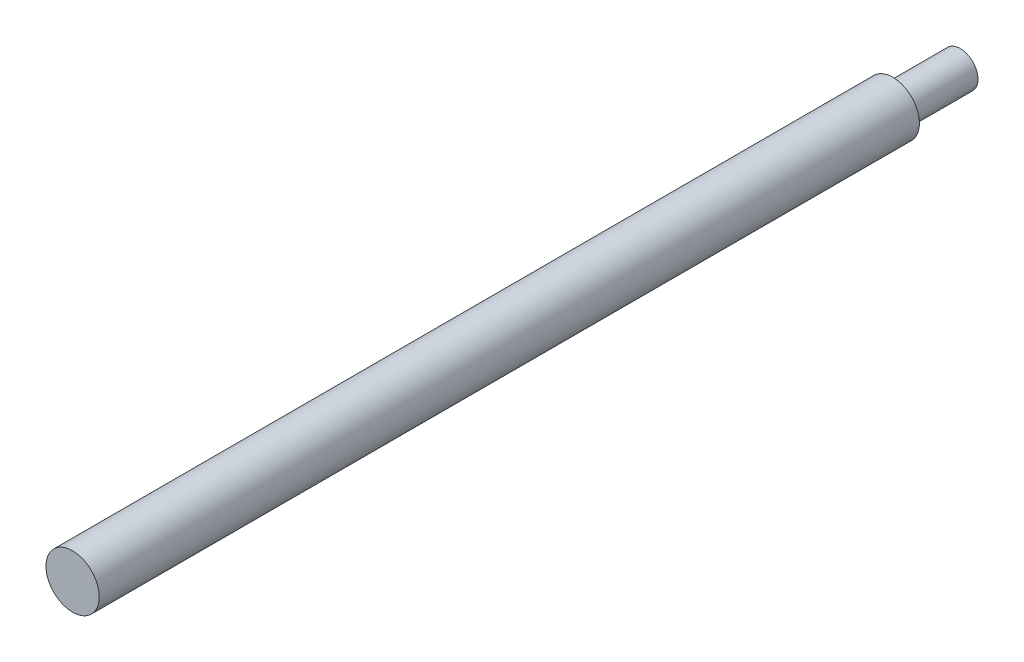
ISO-10303-21;
HEADER;
FILE_DESCRIPTION(('STEP AP214'),'2;1');
FILE_NAME('part.step','',(''),(''),'','','');
FILE_SCHEMA(('AUTOMOTIVE_DESIGN { 1 0 10303 214 1 1 1 1 }'));
ENDSEC;
DATA;
#1=APPLICATION_CONTEXT('core data for automotive mechanical design processes');
#2=APPLICATION_PROTOCOL_DEFINITION('international standard','automotive_design',2000,#1);
#3=PRODUCT_CONTEXT('',#1,'mechanical');
#4=PRODUCT('Part','Part','',(#3));
#5=PRODUCT_RELATED_PRODUCT_CATEGORY('part','',(#4));
#6=PRODUCT_DEFINITION_FORMATION('','',#4);
#7=PRODUCT_DEFINITION_CONTEXT('part definition',#1,'design');
#8=PRODUCT_DEFINITION('design','',#6,#7);
#9=PRODUCT_DEFINITION_SHAPE('','',#8);
#10=(LENGTH_UNIT() NAMED_UNIT(*) SI_UNIT(.MILLI.,.METRE.));
#11=(NAMED_UNIT(*) PLANE_ANGLE_UNIT() SI_UNIT($,.RADIAN.));
#12=(NAMED_UNIT(*) SI_UNIT($,.STERADIAN.) SOLID_ANGLE_UNIT());
#13=UNCERTAINTY_MEASURE_WITH_UNIT(LENGTH_MEASURE(1.E-05),#10,'distance_accuracy_value','');
#14=(GEOMETRIC_REPRESENTATION_CONTEXT(3) GLOBAL_UNCERTAINTY_ASSIGNED_CONTEXT((#13)) GLOBAL_UNIT_ASSIGNED_CONTEXT((#10,
#11,#12)) REPRESENTATION_CONTEXT('',''));
#15=CARTESIAN_POINT('',(0.,0.,0.));
#16=DIRECTION('',(0.,0.,1.));
#17=DIRECTION('',(1.,0.,0.));
#18=AXIS2_PLACEMENT_3D('',#15,#16,#17);
#19=CARTESIAN_POINT('',(0.,0.,250.));
#20=DIRECTION('',(0.,0.,-1.));
#21=DIRECTION('',(-1.,0.,0.));
#22=AXIS2_PLACEMENT_3D('',#19,#20,#21);
#23=CYLINDRICAL_SURFACE('',#22,7.5);
#24=CARTESIAN_POINT('',(0.,0.,19.));
#25=DIRECTION('',(0.,0.,1.));
#26=DIRECTION('',(1.,0.,0.));
#27=AXIS2_PLACEMENT_3D('',#24,#25,#26);
#28=CIRCLE('',#27,7.5);
#29=CARTESIAN_POINT('',(7.5,0.,19.));
#30=VERTEX_POINT('',#29);
#31=EDGE_CURVE('E34',#30,#30,#28,.T.);
#32=ORIENTED_EDGE('',*,*,#31,.T.);
#33=EDGE_LOOP('',(#32));
#34=FACE_BOUND('',#33,.T.);
#35=CARTESIAN_POINT('',(0.,0.,250.));
#36=DIRECTION('',(0.,0.,1.));
#37=DIRECTION('',(1.,0.,0.));
#38=AXIS2_PLACEMENT_3D('',#35,#36,#37);
#39=CIRCLE('',#38,7.5);
#40=CARTESIAN_POINT('',(7.5,0.,250.));
#41=VERTEX_POINT('',#40);
#42=EDGE_CURVE('E10',#41,#41,#39,.T.);
#43=ORIENTED_EDGE('',*,*,#42,.F.);
#44=EDGE_LOOP('',(#43));
#45=FACE_BOUND('',#44,.T.);
#46=ADVANCED_FACE('F31',(#34,#45),#23,.T.);
#47=CARTESIAN_POINT('',(0.,0.,250.));
#48=DIRECTION('',(0.,0.,1.));
#49=DIRECTION('',(1.,0.,0.));
#50=AXIS2_PLACEMENT_3D('',#47,#48,#49);
#51=PLANE('',#50);
#52=ORIENTED_EDGE('',*,*,#42,.T.);
#53=EDGE_LOOP('',(#52));
#54=FACE_BOUND('',#53,.T.);
#55=ADVANCED_FACE('F65',(#54),#51,.T.);
#56=CARTESIAN_POINT('',(0.,0.,19.));
#57=DIRECTION('',(0.,0.,1.));
#58=DIRECTION('',(1.,0.,0.));
#59=AXIS2_PLACEMENT_3D('',#56,#57,#58);
#60=PLANE('',#59);
#61=CARTESIAN_POINT('',(0.,0.,19.));
#62=DIRECTION('',(0.,0.,1.));
#63=DIRECTION('',(1.,0.,0.));
#64=AXIS2_PLACEMENT_3D('',#61,#62,#63);
#65=CIRCLE('',#64,5.);
#66=CARTESIAN_POINT('',(5.,0.,19.));
#67=VERTEX_POINT('',#66);
#68=EDGE_CURVE('E41',#67,#67,#65,.T.);
#69=ORIENTED_EDGE('',*,*,#68,.T.);
#70=EDGE_LOOP('',(#69));
#71=FACE_BOUND('',#70,.T.);
#72=ORIENTED_EDGE('',*,*,#31,.F.);
#73=EDGE_LOOP('',(#72));
#74=FACE_BOUND('',#73,.T.);
#75=ADVANCED_FACE('F49',(#71,#74),#60,.F.);
#76=CARTESIAN_POINT('',(0.,0.,19.));
#77=DIRECTION('',(0.,0.,-1.));
#78=DIRECTION('',(-1.,0.,0.));
#79=AXIS2_PLACEMENT_3D('',#76,#77,#78);
#80=CYLINDRICAL_SURFACE('',#79,5.);
#81=ORIENTED_EDGE('',*,*,#68,.F.);
#82=EDGE_LOOP('',(#81));
#83=FACE_BOUND('',#82,.T.);
#84=CARTESIAN_POINT('',(0.,0.,0.));
#85=DIRECTION('',(0.,0.,1.));
#86=DIRECTION('',(1.,0.,0.));
#87=AXIS2_PLACEMENT_3D('',#84,#85,#86);
#88=CIRCLE('',#87,5.);
#89=CARTESIAN_POINT('',(5.,0.,0.));
#90=VERTEX_POINT('',#89);
#91=EDGE_CURVE('E43',#90,#90,#88,.T.);
#92=ORIENTED_EDGE('',*,*,#91,.T.);
#93=EDGE_LOOP('',(#92));
#94=FACE_BOUND('',#93,.T.);
#95=ADVANCED_FACE('F52',(#83,#94),#80,.T.);
#96=CARTESIAN_POINT('',(0.,0.,0.));
#97=DIRECTION('',(0.,0.,1.));
#98=DIRECTION('',(1.,0.,0.));
#99=AXIS2_PLACEMENT_3D('',#96,#97,#98);
#100=PLANE('',#99);
#101=ORIENTED_EDGE('',*,*,#91,.F.);
#102=EDGE_LOOP('',(#101));
#103=FACE_BOUND('',#102,.T.);
#104=ADVANCED_FACE('F55',(#103),#100,.F.);
#105=CLOSED_SHELL('',(#46,#55,#75,#95,#104));
#106=MANIFOLD_SOLID_BREP('B2',#105);
#107=ADVANCED_BREP_SHAPE_REPRESENTATION('',(#18,#106),#14);
#108=SHAPE_DEFINITION_REPRESENTATION(#9,#107);
ENDSEC;
END-ISO-10303-21;
